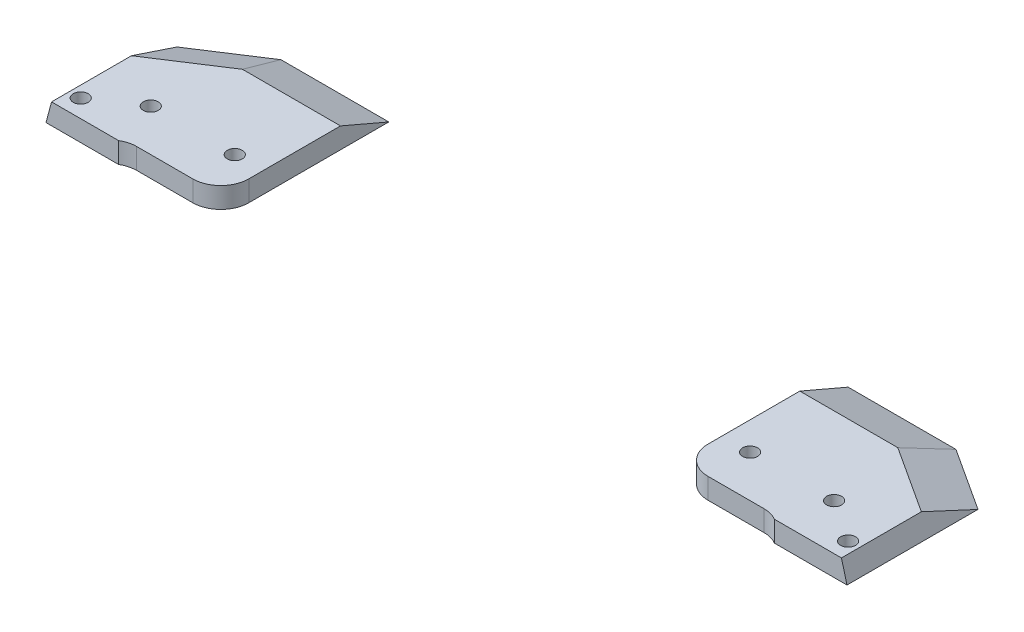
ISO-10303-21;
HEADER;
FILE_DESCRIPTION(('STEP AP214'),'2;1');
FILE_NAME('part.step','',(''),(''),'','','');
FILE_SCHEMA(('AUTOMOTIVE_DESIGN { 1 0 10303 214 1 1 1 1 }'));
ENDSEC;
DATA;
#1=APPLICATION_CONTEXT('core data for automotive mechanical design processes');
#2=APPLICATION_PROTOCOL_DEFINITION('international standard','automotive_design',2000,#1);
#3=PRODUCT_CONTEXT('',#1,'mechanical');
#4=PRODUCT('Part','Part','',(#3));
#5=PRODUCT_RELATED_PRODUCT_CATEGORY('part','',(#4));
#6=PRODUCT_DEFINITION_FORMATION('','',#4);
#7=PRODUCT_DEFINITION_CONTEXT('part definition',#1,'design');
#8=PRODUCT_DEFINITION('design','',#6,#7);
#9=PRODUCT_DEFINITION_SHAPE('','',#8);
#10=(LENGTH_UNIT() NAMED_UNIT(*) SI_UNIT(.MILLI.,.METRE.));
#11=(NAMED_UNIT(*) PLANE_ANGLE_UNIT() SI_UNIT($,.RADIAN.));
#12=(NAMED_UNIT(*) SI_UNIT($,.STERADIAN.) SOLID_ANGLE_UNIT());
#13=UNCERTAINTY_MEASURE_WITH_UNIT(LENGTH_MEASURE(1.E-05),#10,'distance_accuracy_value','');
#14=(GEOMETRIC_REPRESENTATION_CONTEXT(3) GLOBAL_UNCERTAINTY_ASSIGNED_CONTEXT((#13)) GLOBAL_UNIT_ASSIGNED_CONTEXT((#10,
#11,#12)) REPRESENTATION_CONTEXT('',''));
#15=CARTESIAN_POINT('',(0.,0.,0.));
#16=DIRECTION('',(0.,0.,1.));
#17=DIRECTION('',(1.,0.,0.));
#18=AXIS2_PLACEMENT_3D('',#15,#16,#17);
#19=CARTESIAN_POINT('',(-47.683205053471,21.0059940800071,-98.0914798077196));
#20=DIRECTION('',(0.,1.,0.));
#21=DIRECTION('',(0.,0.,1.));
#22=AXIS2_PLACEMENT_3D('',#19,#20,#21);
#23=CYLINDRICAL_SURFACE('',#22,1.7);
#24=CARTESIAN_POINT('',(-47.683205053471,27.3559940800071,-98.0914798077196));
#25=DIRECTION('',(0.,-1.,0.));
#26=DIRECTION('',(0.,0.,1.));
#27=AXIS2_PLACEMENT_3D('',#24,#25,#26);
#28=CIRCLE('',#27,1.7);
#29=CARTESIAN_POINT('',(-47.683205053471,27.3559940800071,-96.3914798077196));
#30=VERTEX_POINT('',#29);
#31=EDGE_CURVE('E294',#30,#30,#28,.T.);
#32=ORIENTED_EDGE('',*,*,#31,.F.);
#33=EDGE_LOOP('',(#32));
#34=FACE_BOUND('',#33,.T.);
#35=CARTESIAN_POINT('',(-47.683205053471,24.6569940800071,-98.0914798077196));
#36=DIRECTION('',(0.,1.,0.));
#37=DIRECTION('',(0.,0.,-1.));
#38=AXIS2_PLACEMENT_3D('',#35,#36,#37);
#39=CIRCLE('',#38,1.7);
#40=CARTESIAN_POINT('',(-47.683205053471,24.6569940800071,-99.7914798077196));
#41=VERTEX_POINT('',#40);
#42=EDGE_CURVE('E336',#41,#41,#39,.F.);
#43=ORIENTED_EDGE('',*,*,#42,.T.);
#44=EDGE_LOOP('',(#43));
#45=FACE_BOUND('',#44,.T.);
#46=ADVANCED_FACE('F65',(#34,#45),#23,.F.);
#47=CARTESIAN_POINT('',(-66.733205053471,21.0059940800071,-98.0914798077196));
#48=DIRECTION('',(0.,1.,0.));
#49=DIRECTION('',(0.,0.,1.));
#50=AXIS2_PLACEMENT_3D('',#47,#48,#49);
#51=CYLINDRICAL_SURFACE('',#50,1.7);
#52=CARTESIAN_POINT('',(-66.733205053471,27.3559940800071,-98.0914798077196));
#53=DIRECTION('',(0.,-1.,0.));
#54=DIRECTION('',(0.,0.,1.));
#55=AXIS2_PLACEMENT_3D('',#52,#53,#54);
#56=CIRCLE('',#55,1.7);
#57=CARTESIAN_POINT('',(-66.733205053471,27.3559940800071,-96.3914798077196));
#58=VERTEX_POINT('',#57);
#59=EDGE_CURVE('E366',#58,#58,#56,.T.);
#60=ORIENTED_EDGE('',*,*,#59,.F.);
#61=EDGE_LOOP('',(#60));
#62=FACE_BOUND('',#61,.T.);
#63=CARTESIAN_POINT('',(-66.733205053471,24.6569940800071,-98.0914798077196));
#64=DIRECTION('',(0.,1.,0.));
#65=DIRECTION('',(0.,0.,-1.));
#66=AXIS2_PLACEMENT_3D('',#63,#64,#65);
#67=CIRCLE('',#66,1.7);
#68=CARTESIAN_POINT('',(-66.733205053471,24.6569940800071,-99.7914798077196));
#69=VERTEX_POINT('',#68);
#70=EDGE_CURVE('E332',#69,#69,#67,.F.);
#71=ORIENTED_EDGE('',*,*,#70,.T.);
#72=EDGE_LOOP('',(#71));
#73=FACE_BOUND('',#72,.T.);
#74=ADVANCED_FACE('F377',(#62,#73),#51,.F.);
#75=CARTESIAN_POINT('',(-76.258205053471,21.0059940800071,-91.7414798077196));
#76=DIRECTION('',(0.,1.,0.));
#77=DIRECTION('',(0.,0.,1.));
#78=AXIS2_PLACEMENT_3D('',#75,#76,#77);
#79=CYLINDRICAL_SURFACE('',#78,1.7);
#80=CARTESIAN_POINT('',(-76.258205053471,27.3559940800071,-91.7414798077196));
#81=DIRECTION('',(0.,-1.,0.));
#82=DIRECTION('',(0.,0.,1.));
#83=AXIS2_PLACEMENT_3D('',#80,#81,#82);
#84=CIRCLE('',#83,1.7);
#85=CARTESIAN_POINT('',(-76.258205053471,27.3559940800071,-90.0414798077196));
#86=VERTEX_POINT('',#85);
#87=EDGE_CURVE('E306',#86,#86,#84,.T.);
#88=ORIENTED_EDGE('',*,*,#87,.F.);
#89=EDGE_LOOP('',(#88));
#90=FACE_BOUND('',#89,.T.);
#91=CARTESIAN_POINT('',(-76.258205053471,24.6569940800071,-91.7414798077196));
#92=DIRECTION('',(0.,1.,0.));
#93=DIRECTION('',(0.,0.,-1.));
#94=AXIS2_PLACEMENT_3D('',#91,#92,#93);
#95=CIRCLE('',#94,1.7);
#96=CARTESIAN_POINT('',(-76.258205053471,24.6569940800071,-93.4414798077196));
#97=VERTEX_POINT('',#96);
#98=EDGE_CURVE('E329',#97,#97,#95,.F.);
#99=ORIENTED_EDGE('',*,*,#98,.T.);
#100=EDGE_LOOP('',(#99));
#101=FACE_BOUND('',#100,.T.);
#102=ADVANCED_FACE('F374',(#90,#101),#79,.F.);
#103=CARTESIAN_POINT('',(-41.333205053471,22.6569940800071,-37.7664798077196));
#104=DIRECTION('',(0.,1.,0.));
#105=DIRECTION('',(0.,0.,1.));
#106=AXIS2_PLACEMENT_3D('',#103,#104,#105);
#107=PLANE('',#106);
#108=CARTESIAN_POINT('',(-76.258205053471,22.6569940800071,-91.7414798077196));
#109=DIRECTION('',(0.,1.,0.));
#110=DIRECTION('',(0.,0.,-1.));
#111=AXIS2_PLACEMENT_3D('',#108,#109,#110);
#112=CIRCLE('',#111,3.);
#113=CARTESIAN_POINT('',(-76.258205053471,22.6569940800071,-94.7414798077196));
#114=VERTEX_POINT('',#113);
#115=EDGE_CURVE('E351',#114,#114,#112,.T.);
#116=ORIENTED_EDGE('',*,*,#115,.T.);
#117=EDGE_LOOP('',(#116));
#118=FACE_BOUND('',#117,.T.);
#119=CARTESIAN_POINT('',(-66.733205053471,22.6569940800071,-98.0914798077196));
#120=DIRECTION('',(0.,1.,0.));
#121=DIRECTION('',(0.,0.,-1.));
#122=AXIS2_PLACEMENT_3D('',#119,#120,#121);
#123=CIRCLE('',#122,3.);
#124=CARTESIAN_POINT('',(-66.733205053471,22.6569940800071,-101.09147980772));
#125=VERTEX_POINT('',#124);
#126=EDGE_CURVE('E357',#125,#125,#123,.T.);
#127=ORIENTED_EDGE('',*,*,#126,.T.);
#128=EDGE_LOOP('',(#127));
#129=FACE_BOUND('',#128,.T.);
#130=CARTESIAN_POINT('',(-47.683205053471,22.6569940800071,-98.0914798077196));
#131=DIRECTION('',(0.,1.,0.));
#132=DIRECTION('',(0.,0.,-1.));
#133=AXIS2_PLACEMENT_3D('',#130,#131,#132);
#134=CIRCLE('',#133,3.);
#135=CARTESIAN_POINT('',(-47.683205053471,22.6569940800071,-101.09147980772));
#136=VERTEX_POINT('',#135);
#137=EDGE_CURVE('E344',#136,#136,#134,.T.);
#138=ORIENTED_EDGE('',*,*,#137,.T.);
#139=EDGE_LOOP('',(#138));
#140=FACE_BOUND('',#139,.T.);
#141=DIRECTION('',(1.,0.,0.));
#142=VECTOR('',#141,1.);
#143=CARTESIAN_POINT('',(-90.228205053471,22.6569940800071,-87.6774798077196));
#144=LINE('',#143,#142);
#145=CARTESIAN_POINT('',(-80.068205053471,22.6569940800071,-87.6774798077196));
#146=VERTEX_POINT('',#145);
#147=CARTESIAN_POINT('',(-63.623572162303,22.6569940800071,-87.6774798077196));
#148=VERTEX_POINT('',#147);
#149=EDGE_CURVE('E89',#146,#148,#144,.T.);
#150=ORIENTED_EDGE('',*,*,#149,.F.);
#151=DIRECTION('',(0.,0.,1.));
#152=VECTOR('',#151,1.);
#153=CARTESIAN_POINT('',(-80.068205053471,22.6569940800071,-126.66657980772));
#154=LINE('',#153,#152);
#155=CARTESIAN_POINT('',(-80.068205053471,22.6569940800071,-117.37960480772));
#156=VERTEX_POINT('',#155);
#157=EDGE_CURVE('E83',#156,#146,#154,.T.);
#158=ORIENTED_EDGE('',*,*,#157,.F.);
#159=CARTESIAN_POINT('',(-80.068205053471,22.6569940800071,-117.37960480772));
#160=DIRECTION('',(0.838443616300637,0.,-0.544988350595414));
#161=VECTOR('',#160,1.);
#162=LINE('',#159,#161);
#163=CARTESIAN_POINT('',(-65.780705053471,22.6569940800071,-126.66647980772));
#164=VERTEX_POINT('',#163);
#165=EDGE_CURVE('E141',#156,#164,#162,.T.);
#166=ORIENTED_EDGE('',*,*,#165,.T.);
#167=CARTESIAN_POINT('',(-65.780705053471,22.6569940800071,-126.66647980772));
#168=DIRECTION('',(1.,0.,0.));
#169=VECTOR('',#168,1.);
#170=LINE('',#167,#169);
#171=CARTESIAN_POINT('',(-41.333205053471,22.6569940800071,-126.66647980772));
#172=VERTEX_POINT('',#171);
#173=EDGE_CURVE('E149',#164,#172,#170,.T.);
#174=ORIENTED_EDGE('',*,*,#173,.T.);
#175=CARTESIAN_POINT('',(-41.333205053471,22.6569940800071,-126.66647980772));
#176=DIRECTION('',(0.,0.,1.));
#177=VECTOR('',#176,1.);
#178=LINE('',#175,#177);
#179=CARTESIAN_POINT('',(-41.333205053471,22.6569940800071,-94.9164798077196));
#180=VERTEX_POINT('',#179);
#181=EDGE_CURVE('E150',#172,#180,#178,.T.);
#182=ORIENTED_EDGE('',*,*,#181,.T.);
#183=CARTESIAN_POINT('',(-47.683205053471,22.6569940800071,-94.9164798077196));
#184=DIRECTION('',(0.,-1.,0.));
#185=DIRECTION('',(0.,0.,1.));
#186=AXIS2_PLACEMENT_3D('',#183,#184,#185);
#187=CIRCLE('',#186,6.35);
#188=CARTESIAN_POINT('',(-47.683205053471,22.6569940800071,-88.5664798077196));
#189=VERTEX_POINT('',#188);
#190=EDGE_CURVE('E297',#189,#180,#187,.F.);
#191=ORIENTED_EDGE('',*,*,#190,.F.);
#192=DIRECTION('',(1.,0.,0.));
#193=VECTOR('',#192,1.);
#194=CARTESIAN_POINT('',(-41.333205053471,22.6569940800071,-88.5664798077196));
#195=LINE('',#194,#193);
#196=CARTESIAN_POINT('',(-60.383205053471,22.6569940800071,-88.5664798077196));
#197=VERTEX_POINT('',#196);
#198=EDGE_CURVE('E293',#197,#189,#195,.T.);
#199=ORIENTED_EDGE('',*,*,#198,.F.);
#200=CARTESIAN_POINT('',(-60.383205053471,22.6569940800071,-82.2164798077196));
#201=DIRECTION('',(0.,-1.,0.));
#202=DIRECTION('',(0.,0.,1.));
#203=AXIS2_PLACEMENT_3D('',#200,#201,#202);
#204=CIRCLE('',#203,6.35);
#205=EDGE_CURVE('E327',#148,#197,#204,.T.);
#206=ORIENTED_EDGE('',*,*,#205,.F.);
#207=EDGE_LOOP('',(#150,#158,#166,#174,#182,#191,#199,#206));
#208=FACE_BOUND('',#207,.T.);
#209=ADVANCED_FACE('F139',(#118,#129,#140,#208),#107,.F.);
#210=CARTESIAN_POINT('',(-41.333205053471,27.3559940800071,-37.7664798077196));
#211=DIRECTION('',(0.,-1.,0.));
#212=DIRECTION('',(0.,0.,-1.));
#213=AXIS2_PLACEMENT_3D('',#210,#211,#212);
#214=PLANE('',#213);
#215=ORIENTED_EDGE('',*,*,#87,.T.);
#216=EDGE_LOOP('',(#215));
#217=FACE_BOUND('',#216,.T.);
#218=ORIENTED_EDGE('',*,*,#59,.T.);
#219=EDGE_LOOP('',(#218));
#220=FACE_BOUND('',#219,.T.);
#221=ORIENTED_EDGE('',*,*,#31,.T.);
#222=EDGE_LOOP('',(#221));
#223=FACE_BOUND('',#222,.T.);
#224=CARTESIAN_POINT('',(-78.8091117982372,27.3559940800071,-105.799640423622));
#225=DIRECTION('',(0.838443616300637,0.,-0.544988350595414));
#226=VECTOR('',#225,1.);
#227=LINE('',#224,#226);
#228=CARTESIAN_POINT('',(-78.8091117982372,27.3559940800071,-105.799640423622));
#229=VERTEX_POINT('',#228);
#230=CARTESIAN_POINT('',(-63.558205053471,27.3559940800071,-115.71272980772));
#231=VERTEX_POINT('',#230);
#232=EDGE_CURVE('E160',#229,#231,#227,.T.);
#233=ORIENTED_EDGE('',*,*,#232,.F.);
#234=DIRECTION('',(0.,0.,1.));
#235=VECTOR('',#234,1.);
#236=CARTESIAN_POINT('',(-78.8091117982372,27.3559940800071,-37.7664798077196));
#237=LINE('',#236,#235);
#238=CARTESIAN_POINT('',(-78.8091117982372,27.3559940800071,-87.6774798077196));
#239=VERTEX_POINT('',#238);
#240=EDGE_CURVE('E134',#229,#239,#237,.T.);
#241=ORIENTED_EDGE('',*,*,#240,.T.);
#242=DIRECTION('',(1.,0.,0.));
#243=VECTOR('',#242,1.);
#244=CARTESIAN_POINT('',(-41.333205053471,27.3559940800071,-87.6774798077196));
#245=LINE('',#244,#243);
#246=CARTESIAN_POINT('',(-63.623572162303,27.3559940800071,-87.6774798077196));
#247=VERTEX_POINT('',#246);
#248=EDGE_CURVE('E342',#239,#247,#245,.T.);
#249=ORIENTED_EDGE('',*,*,#248,.T.);
#250=CARTESIAN_POINT('',(-60.383205053471,27.3559940800071,-82.2164798077196));
#251=DIRECTION('',(0.,1.,0.));
#252=DIRECTION('',(0.,0.,-1.));
#253=AXIS2_PLACEMENT_3D('',#250,#251,#252);
#254=CIRCLE('',#253,6.35);
#255=CARTESIAN_POINT('',(-60.383205053471,27.3559940800071,-88.5664798077196));
#256=VERTEX_POINT('',#255);
#257=EDGE_CURVE('E324',#256,#247,#254,.T.);
#258=ORIENTED_EDGE('',*,*,#257,.F.);
#259=DIRECTION('',(1.,0.,0.));
#260=VECTOR('',#259,1.);
#261=CARTESIAN_POINT('',(-41.333205053471,27.3559940800071,-88.5664798077196));
#262=LINE('',#261,#260);
#263=CARTESIAN_POINT('',(-47.683205053471,27.3559940800071,-88.5664798077196));
#264=VERTEX_POINT('',#263);
#265=EDGE_CURVE('E290',#256,#264,#262,.T.);
#266=ORIENTED_EDGE('',*,*,#265,.T.);
#267=CARTESIAN_POINT('',(-47.683205053471,27.3559940800071,-94.9164798077196));
#268=DIRECTION('',(0.,1.,0.));
#269=DIRECTION('',(0.,0.,-1.));
#270=AXIS2_PLACEMENT_3D('',#267,#268,#269);
#271=CIRCLE('',#270,6.35);
#272=CARTESIAN_POINT('',(-41.333205053471,27.3559940800071,-94.9164798077196));
#273=VERTEX_POINT('',#272);
#274=EDGE_CURVE('E151',#273,#264,#271,.F.);
#275=ORIENTED_EDGE('',*,*,#274,.F.);
#276=CARTESIAN_POINT('',(-41.333205053471,27.3559940800071,-115.71272980772));
#277=DIRECTION('',(0.,0.,1.));
#278=VECTOR('',#277,1.);
#279=LINE('',#276,#278);
#280=CARTESIAN_POINT('',(-41.333205053471,27.3559940800071,-115.71272980772));
#281=VERTEX_POINT('',#280);
#282=EDGE_CURVE('E255',#281,#273,#279,.T.);
#283=ORIENTED_EDGE('',*,*,#282,.F.);
#284=CARTESIAN_POINT('',(-63.558205053471,27.3559940800071,-115.71272980772));
#285=DIRECTION('',(1.,0.,0.));
#286=VECTOR('',#285,1.);
#287=LINE('',#284,#286);
#288=EDGE_CURVE('E172',#231,#281,#287,.T.);
#289=ORIENTED_EDGE('',*,*,#288,.F.);
#290=EDGE_LOOP('',(#233,#241,#249,#258,#266,#275,#283,#289));
#291=FACE_BOUND('',#290,.T.);
#292=ADVANCED_FACE('F188',(#217,#220,#223,#291),#214,.F.);
#293=CARTESIAN_POINT('',(-41.333205053471,55.596707666281,-49.881336650527));
#294=DIRECTION('',(0.,0.919007191605898,-0.394240766254125));
#295=DIRECTION('',(0.,0.394240766254125,0.919007191605898));
#296=AXIS2_PLACEMENT_3D('',#293,#294,#295);
#297=PLANE('',#296);
#298=DIRECTION('',(-0.183305751218197,-0.387560731147046,-0.903435488146829));
#299=VECTOR('',#298,1.);
#300=CARTESIAN_POINT('',(-63.558205053471,27.3559940800071,-115.71272980772));
#301=LINE('',#300,#299);
#302=EDGE_CURVE('E147',#231,#164,#301,.T.);
#303=ORIENTED_EDGE('',*,*,#302,.F.);
#304=ORIENTED_EDGE('',*,*,#288,.T.);
#305=DIRECTION('',(0.,-0.394240766254125,-0.919007191605898));
#306=VECTOR('',#305,1.);
#307=CARTESIAN_POINT('',(-41.333205053471,27.3559940800071,-115.71272980772));
#308=LINE('',#307,#306);
#309=EDGE_CURVE('E153',#281,#172,#308,.T.);
#310=ORIENTED_EDGE('',*,*,#309,.T.);
#311=ORIENTED_EDGE('',*,*,#173,.F.);
#312=EDGE_LOOP('',(#303,#304,#310,#311));
#313=FACE_BOUND('',#312,.T.);
#314=ADVANCED_FACE('F178',(#313),#297,.T.);
#315=CARTESIAN_POINT('',(-41.333205053471,27.3559940800071,-37.7664798077196));
#316=DIRECTION('',(1.,0.,0.));
#317=DIRECTION('',(0.,0.,1.));
#318=AXIS2_PLACEMENT_3D('',#315,#316,#317);
#319=PLANE('',#318);
#320=ORIENTED_EDGE('',*,*,#181,.F.);
#321=ORIENTED_EDGE('',*,*,#309,.F.);
#322=ORIENTED_EDGE('',*,*,#282,.T.);
#323=DIRECTION('',(0.,1.,0.));
#324=VECTOR('',#323,1.);
#325=CARTESIAN_POINT('',(-41.333205053471,27.3559940800071,-94.9164798077196));
#326=LINE('',#325,#324);
#327=EDGE_CURVE('E309',#180,#273,#326,.T.);
#328=ORIENTED_EDGE('',*,*,#327,.F.);
#329=EDGE_LOOP('',(#320,#321,#322,#328));
#330=FACE_BOUND('',#329,.T.);
#331=ADVANCED_FACE('F187',(#330),#319,.T.);
#332=CARTESIAN_POINT('',(-48.4960519978189,56.4317917075317,-48.7862443374856));
#333=DIRECTION('',(-0.224481809597883,0.91122813563382,-0.34535663015059));
#334=DIRECTION('',(0.,0.354401567922344,0.935093326173481));
#335=AXIS2_PLACEMENT_3D('',#332,#333,#334);
#336=PLANE('',#335);
#337=DIRECTION('',(-0.100243770859435,-0.374114845989711,-0.921948625691245));
#338=VECTOR('',#337,1.);
#339=CARTESIAN_POINT('',(-72.1449254450297,52.2270761412848,-44.5086754388216));
#340=LINE('',#339,#338);
#341=EDGE_CURVE('E131',#229,#156,#340,.T.);
#342=ORIENTED_EDGE('',*,*,#341,.F.);
#343=ORIENTED_EDGE('',*,*,#232,.T.);
#344=ORIENTED_EDGE('',*,*,#302,.T.);
#345=ORIENTED_EDGE('',*,*,#165,.F.);
#346=EDGE_LOOP('',(#342,#343,#344,#345));
#347=FACE_BOUND('',#346,.T.);
#348=ADVANCED_FACE('F145',(#347),#336,.T.);
#349=CARTESIAN_POINT('',(-41.333205053471,21.0059940800071,-88.5664798077196));
#350=DIRECTION('',(0.,0.,-1.));
#351=DIRECTION('',(1.,0.,0.));
#352=AXIS2_PLACEMENT_3D('',#349,#350,#351);
#353=PLANE('',#352);
#354=ORIENTED_EDGE('',*,*,#265,.F.);
#355=DIRECTION('',(0.,1.,0.));
#356=VECTOR('',#355,1.);
#357=CARTESIAN_POINT('',(-60.383205053471,27.3559940800071,-88.5664798077196));
#358=LINE('',#357,#356);
#359=EDGE_CURVE('E316',#197,#256,#358,.T.);
#360=ORIENTED_EDGE('',*,*,#359,.F.);
#361=ORIENTED_EDGE('',*,*,#198,.T.);
#362=DIRECTION('',(0.,1.,0.));
#363=VECTOR('',#362,1.);
#364=CARTESIAN_POINT('',(-47.683205053471,22.6569940800071,-88.5664798077196));
#365=LINE('',#364,#363);
#366=EDGE_CURVE('E315',#264,#189,#365,.F.);
#367=ORIENTED_EDGE('',*,*,#366,.F.);
#368=EDGE_LOOP('',(#354,#360,#361,#367));
#369=FACE_BOUND('',#368,.T.);
#370=ADVANCED_FACE('F216',(#369),#353,.F.);
#371=CARTESIAN_POINT('',(-47.683205053471,27.3559940800071,-94.9164798077196));
#372=DIRECTION('',(0.,-1.,0.));
#373=DIRECTION('',(0.,0.,-1.));
#374=AXIS2_PLACEMENT_3D('',#371,#372,#373);
#375=CYLINDRICAL_SURFACE('',#374,6.35);
#376=ORIENTED_EDGE('',*,*,#190,.T.);
#377=ORIENTED_EDGE('',*,*,#327,.T.);
#378=ORIENTED_EDGE('',*,*,#274,.T.);
#379=ORIENTED_EDGE('',*,*,#366,.T.);
#380=EDGE_LOOP('',(#376,#377,#378,#379));
#381=FACE_BOUND('',#380,.T.);
#382=ADVANCED_FACE('F314',(#381),#375,.T.);
#383=CARTESIAN_POINT('',(-60.383205053471,21.0059940800071,-82.2164798077196));
#384=DIRECTION('',(0.,-1.,0.));
#385=DIRECTION('',(0.,0.,-1.));
#386=AXIS2_PLACEMENT_3D('',#383,#384,#385);
#387=CYLINDRICAL_SURFACE('',#386,6.35);
#388=ORIENTED_EDGE('',*,*,#257,.T.);
#389=DIRECTION('',(0.,-1.,0.));
#390=VECTOR('',#389,1.);
#391=CARTESIAN_POINT('',(-63.623572162303,21.0059940800071,-87.6774798077196));
#392=LINE('',#391,#390);
#393=EDGE_CURVE('E75',#247,#148,#392,.T.);
#394=ORIENTED_EDGE('',*,*,#393,.T.);
#395=ORIENTED_EDGE('',*,*,#205,.T.);
#396=ORIENTED_EDGE('',*,*,#359,.T.);
#397=EDGE_LOOP('',(#388,#394,#395,#396));
#398=FACE_BOUND('',#397,.T.);
#399=ADVANCED_FACE('F67',(#398),#387,.F.);
#400=CARTESIAN_POINT('',(-76.258205053471,24.6569940800071,-91.7414798077196));
#401=DIRECTION('',(0.,-1.,0.));
#402=DIRECTION('',(0.,0.,-1.));
#403=AXIS2_PLACEMENT_3D('',#400,#401,#402);
#404=PLANE('',#403);
#405=CARTESIAN_POINT('',(-76.258205053471,24.6569940800071,-91.7414798077196));
#406=DIRECTION('',(0.,1.,0.));
#407=DIRECTION('',(0.,0.,-1.));
#408=AXIS2_PLACEMENT_3D('',#405,#406,#407);
#409=CIRCLE('',#408,3.);
#410=CARTESIAN_POINT('',(-76.258205053471,24.6569940800071,-94.7414798077196));
#411=VERTEX_POINT('',#410);
#412=EDGE_CURVE('E333',#411,#411,#409,.T.);
#413=ORIENTED_EDGE('',*,*,#412,.F.);
#414=EDGE_LOOP('',(#413));
#415=FACE_BOUND('',#414,.T.);
#416=ORIENTED_EDGE('',*,*,#98,.F.);
#417=EDGE_LOOP('',(#416));
#418=FACE_BOUND('',#417,.T.);
#419=ADVANCED_FACE('F381',(#415,#418),#404,.T.);
#420=CARTESIAN_POINT('',(-76.258205053471,24.6569940800071,-91.7414798077196));
#421=DIRECTION('',(0.,-1.,0.));
#422=DIRECTION('',(0.,0.,-1.));
#423=AXIS2_PLACEMENT_3D('',#420,#421,#422);
#424=CYLINDRICAL_SURFACE('',#423,3.);
#425=ORIENTED_EDGE('',*,*,#412,.T.);
#426=EDGE_LOOP('',(#425));
#427=FACE_BOUND('',#426,.T.);
#428=ORIENTED_EDGE('',*,*,#115,.F.);
#429=EDGE_LOOP('',(#428));
#430=FACE_BOUND('',#429,.T.);
#431=ADVANCED_FACE('F383',(#427,#430),#424,.F.);
#432=CARTESIAN_POINT('',(-66.733205053471,24.6569940800071,-98.0914798077196));
#433=DIRECTION('',(0.,-1.,0.));
#434=DIRECTION('',(0.,0.,-1.));
#435=AXIS2_PLACEMENT_3D('',#432,#433,#434);
#436=PLANE('',#435);
#437=CARTESIAN_POINT('',(-66.733205053471,24.6569940800071,-98.0914798077196));
#438=DIRECTION('',(0.,1.,0.));
#439=DIRECTION('',(0.,0.,-1.));
#440=AXIS2_PLACEMENT_3D('',#437,#438,#439);
#441=CIRCLE('',#440,3.);
#442=CARTESIAN_POINT('',(-66.733205053471,24.6569940800071,-101.09147980772));
#443=VERTEX_POINT('',#442);
#444=EDGE_CURVE('E354',#443,#443,#441,.T.);
#445=ORIENTED_EDGE('',*,*,#444,.F.);
#446=EDGE_LOOP('',(#445));
#447=FACE_BOUND('',#446,.T.);
#448=ORIENTED_EDGE('',*,*,#70,.F.);
#449=EDGE_LOOP('',(#448));
#450=FACE_BOUND('',#449,.T.);
#451=ADVANCED_FACE('F391',(#447,#450),#436,.T.);
#452=CARTESIAN_POINT('',(-66.733205053471,24.6569940800071,-98.0914798077196));
#453=DIRECTION('',(0.,-1.,0.));
#454=DIRECTION('',(0.,0.,-1.));
#455=AXIS2_PLACEMENT_3D('',#452,#453,#454);
#456=CYLINDRICAL_SURFACE('',#455,3.);
#457=ORIENTED_EDGE('',*,*,#444,.T.);
#458=EDGE_LOOP('',(#457));
#459=FACE_BOUND('',#458,.T.);
#460=ORIENTED_EDGE('',*,*,#126,.F.);
#461=EDGE_LOOP('',(#460));
#462=FACE_BOUND('',#461,.T.);
#463=ADVANCED_FACE('F439',(#459,#462),#456,.F.);
#464=CARTESIAN_POINT('',(-47.683205053471,24.6569940800071,-98.0914798077196));
#465=DIRECTION('',(0.,-1.,0.));
#466=DIRECTION('',(0.,0.,-1.));
#467=AXIS2_PLACEMENT_3D('',#464,#465,#466);
#468=PLANE('',#467);
#469=CARTESIAN_POINT('',(-47.683205053471,24.6569940800071,-98.0914798077196));
#470=DIRECTION('',(0.,1.,0.));
#471=DIRECTION('',(0.,0.,-1.));
#472=AXIS2_PLACEMENT_3D('',#469,#470,#471);
#473=CIRCLE('',#472,3.);
#474=CARTESIAN_POINT('',(-47.683205053471,24.6569940800071,-101.09147980772));
#475=VERTEX_POINT('',#474);
#476=EDGE_CURVE('E360',#475,#475,#473,.T.);
#477=ORIENTED_EDGE('',*,*,#476,.F.);
#478=EDGE_LOOP('',(#477));
#479=FACE_BOUND('',#478,.T.);
#480=ORIENTED_EDGE('',*,*,#42,.F.);
#481=EDGE_LOOP('',(#480));
#482=FACE_BOUND('',#481,.T.);
#483=ADVANCED_FACE('F433',(#479,#482),#468,.T.);
#484=CARTESIAN_POINT('',(-47.683205053471,24.6569940800071,-98.0914798077196));
#485=DIRECTION('',(0.,-1.,0.));
#486=DIRECTION('',(0.,0.,-1.));
#487=AXIS2_PLACEMENT_3D('',#484,#485,#486);
#488=CYLINDRICAL_SURFACE('',#487,3.);
#489=ORIENTED_EDGE('',*,*,#476,.T.);
#490=EDGE_LOOP('',(#489));
#491=FACE_BOUND('',#490,.T.);
#492=ORIENTED_EDGE('',*,*,#137,.F.);
#493=EDGE_LOOP('',(#492));
#494=FACE_BOUND('',#493,.T.);
#495=ADVANCED_FACE('F409',(#491,#494),#488,.F.);
#496=CARTESIAN_POINT('',(-90.228205053471,75.7639945683738,-87.6774798077196));
#497=DIRECTION('',(0.,0.,-1.));
#498=DIRECTION('',(-1.,0.,0.));
#499=AXIS2_PLACEMENT_3D('',#496,#497,#498);
#500=PLANE('',#499);
#501=ORIENTED_EDGE('',*,*,#248,.F.);
#502=DIRECTION('',(-0.258819045102517,-0.965925826289069,0.));
#503=VECTOR('',#502,1.);
#504=CARTESIAN_POINT('',(-67.4720458801545,69.6665000950497,-87.6774798077196));
#505=LINE('',#504,#503);
#506=EDGE_CURVE('E12',#239,#146,#505,.T.);
#507=ORIENTED_EDGE('',*,*,#506,.T.);
#508=ORIENTED_EDGE('',*,*,#149,.T.);
#509=ORIENTED_EDGE('',*,*,#393,.F.);
#510=EDGE_LOOP('',(#501,#507,#508,#509));
#511=FACE_BOUND('',#510,.T.);
#512=ADVANCED_FACE('F420',(#511),#500,.F.);
#513=CARTESIAN_POINT('',(-75.2968482529229,40.4639400806923,-126.66657980772));
#514=DIRECTION('',(0.965925826289069,-0.258819045102517,0.));
#515=DIRECTION('',(0.258819045102517,0.965925826289069,0.));
#516=AXIS2_PLACEMENT_3D('',#513,#514,#515);
#517=PLANE('',#516);
#518=ORIENTED_EDGE('',*,*,#341,.T.);
#519=ORIENTED_EDGE('',*,*,#157,.T.);
#520=ORIENTED_EDGE('',*,*,#506,.F.);
#521=ORIENTED_EDGE('',*,*,#240,.F.);
#522=EDGE_LOOP('',(#518,#519,#520,#521));
#523=FACE_BOUND('',#522,.T.);
#524=ADVANCED_FACE('F132',(#523),#517,.F.);
#525=CLOSED_SHELL('',(#46,#74,#102,#209,#292,#314,#331,#348,#370,#382,#399,#419,#431,#451,#463,
#483,#495,#512,#524));
#526=MANIFOLD_SOLID_BREP('B2',#525);
#527=CARTESIAN_POINT('',(69.156794946529,21.0059940800071,-98.0914798077196));
#528=DIRECTION('',(0.,1.,0.));
#529=DIRECTION('',(0.,0.,1.));
#530=AXIS2_PLACEMENT_3D('',#527,#528,#529);
#531=CYLINDRICAL_SURFACE('',#530,1.7);
#532=CARTESIAN_POINT('',(69.156794946529,27.3559940800071,-98.0914798077196));
#533=DIRECTION('',(0.,1.,0.));
#534=DIRECTION('',(0.,0.,1.));
#535=AXIS2_PLACEMENT_3D('',#532,#533,#534);
#536=CIRCLE('',#535,1.7);
#537=CARTESIAN_POINT('',(69.156794946529,27.3559940800071,-96.3914798077196));
#538=VERTEX_POINT('',#537);
#539=EDGE_CURVE('E716',#538,#538,#536,.T.);
#540=ORIENTED_EDGE('',*,*,#539,.T.);
#541=EDGE_LOOP('',(#540));
#542=FACE_BOUND('',#541,.T.);
#543=CARTESIAN_POINT('',(69.156794946529,24.6569940800071,-98.0914798077196));
#544=DIRECTION('',(0.,-1.,0.));
#545=DIRECTION('',(0.,0.,-1.));
#546=AXIS2_PLACEMENT_3D('',#543,#544,#545);
#547=CIRCLE('',#546,1.7);
#548=CARTESIAN_POINT('',(69.156794946529,24.6569940800071,-99.7914798077196));
#549=VERTEX_POINT('',#548);
#550=EDGE_CURVE('E857',#549,#549,#547,.F.);
#551=ORIENTED_EDGE('',*,*,#550,.F.);
#552=EDGE_LOOP('',(#551));
#553=FACE_BOUND('',#552,.T.);
#554=ADVANCED_FACE('F584',(#542,#553),#531,.F.);
#555=CARTESIAN_POINT('',(88.206794946529,21.0059940800071,-98.0914798077196));
#556=DIRECTION('',(0.,1.,0.));
#557=DIRECTION('',(0.,0.,1.));
#558=AXIS2_PLACEMENT_3D('',#555,#556,#557);
#559=CYLINDRICAL_SURFACE('',#558,1.7);
#560=CARTESIAN_POINT('',(88.206794946529,27.3559940800071,-98.0914798077196));
#561=DIRECTION('',(0.,1.,0.));
#562=DIRECTION('',(0.,0.,1.));
#563=AXIS2_PLACEMENT_3D('',#560,#561,#562);
#564=CIRCLE('',#563,1.7);
#565=CARTESIAN_POINT('',(88.206794946529,27.3559940800071,-96.3914798077196));
#566=VERTEX_POINT('',#565);
#567=EDGE_CURVE('E887',#566,#566,#564,.T.);
#568=ORIENTED_EDGE('',*,*,#567,.T.);
#569=EDGE_LOOP('',(#568));
#570=FACE_BOUND('',#569,.T.);
#571=CARTESIAN_POINT('',(88.206794946529,24.6569940800071,-98.0914798077196));
#572=DIRECTION('',(0.,-1.,0.));
#573=DIRECTION('',(0.,0.,-1.));
#574=AXIS2_PLACEMENT_3D('',#571,#572,#573);
#575=CIRCLE('',#574,1.7);
#576=CARTESIAN_POINT('',(88.206794946529,24.6569940800071,-99.7914798077196));
#577=VERTEX_POINT('',#576);
#578=EDGE_CURVE('E853',#577,#577,#575,.F.);
#579=ORIENTED_EDGE('',*,*,#578,.F.);
#580=EDGE_LOOP('',(#579));
#581=FACE_BOUND('',#580,.T.);
#582=ADVANCED_FACE('F901',(#570,#581),#559,.F.);
#583=CARTESIAN_POINT('',(97.731794946529,21.0059940800071,-91.7414798077196));
#584=DIRECTION('',(0.,1.,0.));
#585=DIRECTION('',(0.,0.,1.));
#586=AXIS2_PLACEMENT_3D('',#583,#584,#585);
#587=CYLINDRICAL_SURFACE('',#586,1.7);
#588=CARTESIAN_POINT('',(97.731794946529,27.3559940800071,-91.7414798077196));
#589=DIRECTION('',(0.,1.,0.));
#590=DIRECTION('',(0.,0.,1.));
#591=AXIS2_PLACEMENT_3D('',#588,#589,#590);
#592=CIRCLE('',#591,1.7);
#593=CARTESIAN_POINT('',(97.731794946529,27.3559940800071,-90.0414798077196));
#594=VERTEX_POINT('',#593);
#595=EDGE_CURVE('E730',#594,#594,#592,.T.);
#596=ORIENTED_EDGE('',*,*,#595,.T.);
#597=EDGE_LOOP('',(#596));
#598=FACE_BOUND('',#597,.T.);
#599=CARTESIAN_POINT('',(97.731794946529,24.6569940800071,-91.7414798077196));
#600=DIRECTION('',(0.,-1.,0.));
#601=DIRECTION('',(0.,0.,-1.));
#602=AXIS2_PLACEMENT_3D('',#599,#600,#601);
#603=CIRCLE('',#602,1.7);
#604=CARTESIAN_POINT('',(97.731794946529,24.6569940800071,-93.4414798077196));
#605=VERTEX_POINT('',#604);
#606=EDGE_CURVE('E850',#605,#605,#603,.F.);
#607=ORIENTED_EDGE('',*,*,#606,.F.);
#608=EDGE_LOOP('',(#607));
#609=FACE_BOUND('',#608,.T.);
#610=ADVANCED_FACE('F695',(#598,#609),#587,.F.);
#611=CARTESIAN_POINT('',(62.806794946529,22.6569940800071,-37.7664798077196));
#612=DIRECTION('',(0.,1.,0.));
#613=DIRECTION('',(0.,0.,1.));
#614=AXIS2_PLACEMENT_3D('',#611,#612,#613);
#615=PLANE('',#614);
#616=CARTESIAN_POINT('',(97.731794946529,22.6569940800071,-91.7414798077196));
#617=DIRECTION('',(0.,-1.,0.));
#618=DIRECTION('',(0.,0.,-1.));
#619=AXIS2_PLACEMENT_3D('',#616,#617,#618);
#620=CIRCLE('',#619,3.);
#621=CARTESIAN_POINT('',(97.731794946529,22.6569940800071,-94.7414798077196));
#622=VERTEX_POINT('',#621);
#623=EDGE_CURVE('E875',#622,#622,#620,.T.);
#624=ORIENTED_EDGE('',*,*,#623,.F.);
#625=EDGE_LOOP('',(#624));
#626=FACE_BOUND('',#625,.T.);
#627=CARTESIAN_POINT('',(88.206794946529,22.6569940800071,-98.0914798077196));
#628=DIRECTION('',(0.,-1.,0.));
#629=DIRECTION('',(0.,0.,-1.));
#630=AXIS2_PLACEMENT_3D('',#627,#628,#629);
#631=CIRCLE('',#630,3.);
#632=CARTESIAN_POINT('',(88.206794946529,22.6569940800071,-101.09147980772));
#633=VERTEX_POINT('',#632);
#634=EDGE_CURVE('E881',#633,#633,#631,.T.);
#635=ORIENTED_EDGE('',*,*,#634,.F.);
#636=EDGE_LOOP('',(#635));
#637=FACE_BOUND('',#636,.T.);
#638=CARTESIAN_POINT('',(69.156794946529,22.6569940800071,-98.0914798077196));
#639=DIRECTION('',(0.,-1.,0.));
#640=DIRECTION('',(0.,0.,-1.));
#641=AXIS2_PLACEMENT_3D('',#638,#639,#640);
#642=CIRCLE('',#641,3.);
#643=CARTESIAN_POINT('',(69.156794946529,22.6569940800071,-101.09147980772));
#644=VERTEX_POINT('',#643);
#645=EDGE_CURVE('E863',#644,#644,#642,.T.);
#646=ORIENTED_EDGE('',*,*,#645,.F.);
#647=EDGE_LOOP('',(#646));
#648=FACE_BOUND('',#647,.T.);
#649=CARTESIAN_POINT('',(101.541794946529,22.6569940800071,-117.37960480772));
#650=DIRECTION('',(-0.838443616300637,0.,-0.544988350595415));
#651=VECTOR('',#650,1.);
#652=LINE('',#649,#651);
#653=CARTESIAN_POINT('',(101.541794946529,22.6569940800071,-117.37960480772));
#654=VERTEX_POINT('',#653);
#655=CARTESIAN_POINT('',(87.254294946529,22.6569940800071,-126.66647980772));
#656=VERTEX_POINT('',#655);
#657=EDGE_CURVE('E661',#654,#656,#652,.T.);
#658=ORIENTED_EDGE('',*,*,#657,.F.);
#659=DIRECTION('',(0.,0.,1.));
#660=VECTOR('',#659,1.);
#661=CARTESIAN_POINT('',(101.541794946529,22.6569940800071,-126.66657980772));
#662=LINE('',#661,#660);
#663=CARTESIAN_POINT('',(101.541794946529,22.6569940800071,-87.6774798077196));
#664=VERTEX_POINT('',#663);
#665=EDGE_CURVE('E649',#654,#664,#662,.T.);
#666=ORIENTED_EDGE('',*,*,#665,.T.);
#667=DIRECTION('',(1.,0.,0.));
#668=VECTOR('',#667,1.);
#669=CARTESIAN_POINT('',(-90.228205053471,22.6569940800071,-87.6774798077196));
#670=LINE('',#669,#668);
#671=CARTESIAN_POINT('',(85.0971620553609,22.6569940800071,-87.6774798077196));
#672=VERTEX_POINT('',#671);
#673=EDGE_CURVE('E665',#672,#664,#670,.T.);
#674=ORIENTED_EDGE('',*,*,#673,.F.);
#675=CARTESIAN_POINT('',(81.856794946529,22.6569940800071,-82.2164798077196));
#676=DIRECTION('',(0.,1.,0.));
#677=DIRECTION('',(0.,0.,1.));
#678=AXIS2_PLACEMENT_3D('',#675,#676,#677);
#679=CIRCLE('',#678,6.35);
#680=CARTESIAN_POINT('',(81.856794946529,22.6569940800071,-88.5664798077196));
#681=VERTEX_POINT('',#680);
#682=EDGE_CURVE('E848',#672,#681,#679,.T.);
#683=ORIENTED_EDGE('',*,*,#682,.T.);
#684=DIRECTION('',(-1.,0.,0.));
#685=VECTOR('',#684,1.);
#686=CARTESIAN_POINT('',(62.806794946529,22.6569940800071,-88.5664798077196));
#687=LINE('',#686,#685);
#688=CARTESIAN_POINT('',(69.156794946529,22.6569940800071,-88.5664798077196));
#689=VERTEX_POINT('',#688);
#690=EDGE_CURVE('E715',#681,#689,#687,.T.);
#691=ORIENTED_EDGE('',*,*,#690,.T.);
#692=CARTESIAN_POINT('',(69.156794946529,22.6569940800071,-94.9164798077196));
#693=DIRECTION('',(0.,1.,0.));
#694=DIRECTION('',(0.,0.,1.));
#695=AXIS2_PLACEMENT_3D('',#692,#693,#694);
#696=CIRCLE('',#695,6.35);
#697=CARTESIAN_POINT('',(62.806794946529,22.6569940800071,-94.9164798077196));
#698=VERTEX_POINT('',#697);
#699=EDGE_CURVE('E719',#689,#698,#696,.F.);
#700=ORIENTED_EDGE('',*,*,#699,.T.);
#701=CARTESIAN_POINT('',(62.806794946529,22.6569940800071,-126.66647980772));
#702=DIRECTION('',(0.,0.,1.));
#703=VECTOR('',#702,1.);
#704=LINE('',#701,#703);
#705=CARTESIAN_POINT('',(62.806794946529,22.6569940800071,-126.66647980772));
#706=VERTEX_POINT('',#705);
#707=EDGE_CURVE('E674',#706,#698,#704,.T.);
#708=ORIENTED_EDGE('',*,*,#707,.F.);
#709=CARTESIAN_POINT('',(87.254294946529,22.6569940800071,-126.66647980772));
#710=DIRECTION('',(-1.,0.,0.));
#711=VECTOR('',#710,1.);
#712=LINE('',#709,#711);
#713=EDGE_CURVE('E671',#656,#706,#712,.T.);
#714=ORIENTED_EDGE('',*,*,#713,.F.);
#715=EDGE_LOOP('',(#658,#666,#674,#683,#691,#700,#708,#714));
#716=FACE_BOUND('',#715,.T.);
#717=ADVANCED_FACE('F668',(#626,#637,#648,#716),#615,.F.);
#718=CARTESIAN_POINT('',(62.806794946529,27.3559940800071,-37.7664798077196));
#719=DIRECTION('',(0.,-1.,0.));
#720=DIRECTION('',(0.,0.,-1.));
#721=AXIS2_PLACEMENT_3D('',#718,#719,#720);
#722=PLANE('',#721);
#723=ORIENTED_EDGE('',*,*,#595,.F.);
#724=EDGE_LOOP('',(#723));
#725=FACE_BOUND('',#724,.T.);
#726=ORIENTED_EDGE('',*,*,#567,.F.);
#727=EDGE_LOOP('',(#726));
#728=FACE_BOUND('',#727,.T.);
#729=ORIENTED_EDGE('',*,*,#539,.F.);
#730=EDGE_LOOP('',(#729));
#731=FACE_BOUND('',#730,.T.);
#732=DIRECTION('',(1.,0.,0.));
#733=VECTOR('',#732,1.);
#734=CARTESIAN_POINT('',(62.806794946529,27.3559940800071,-87.6774798077196));
#735=LINE('',#734,#733);
#736=CARTESIAN_POINT('',(85.0971620553609,27.3559940800071,-87.6774798077196));
#737=VERTEX_POINT('',#736);
#738=CARTESIAN_POINT('',(100.282701691295,27.3559940800071,-87.6774798077196));
#739=VERTEX_POINT('',#738);
#740=EDGE_CURVE('E608',#737,#739,#735,.T.);
#741=ORIENTED_EDGE('',*,*,#740,.T.);
#742=DIRECTION('',(0.,0.,-1.));
#743=VECTOR('',#742,1.);
#744=CARTESIAN_POINT('',(100.282701691295,27.3559940800071,-37.7664798077196));
#745=LINE('',#744,#743);
#746=CARTESIAN_POINT('',(100.282701691295,27.3559940800071,-105.799640423622));
#747=VERTEX_POINT('',#746);
#748=EDGE_CURVE('E602',#739,#747,#745,.T.);
#749=ORIENTED_EDGE('',*,*,#748,.T.);
#750=CARTESIAN_POINT('',(100.282701691295,27.3559940800071,-105.799640423622));
#751=DIRECTION('',(-0.838443616300637,0.,-0.544988350595414));
#752=VECTOR('',#751,1.);
#753=LINE('',#750,#752);
#754=CARTESIAN_POINT('',(85.031794946529,27.3559940800071,-115.71272980772));
#755=VERTEX_POINT('',#754);
#756=EDGE_CURVE('E664',#747,#755,#753,.T.);
#757=ORIENTED_EDGE('',*,*,#756,.T.);
#758=CARTESIAN_POINT('',(85.031794946529,27.3559940800071,-115.71272980772));
#759=DIRECTION('',(-1.,0.,0.));
#760=VECTOR('',#759,1.);
#761=LINE('',#758,#760);
#762=CARTESIAN_POINT('',(62.806794946529,27.3559940800071,-115.71272980772));
#763=VERTEX_POINT('',#762);
#764=EDGE_CURVE('E797',#755,#763,#761,.T.);
#765=ORIENTED_EDGE('',*,*,#764,.T.);
#766=CARTESIAN_POINT('',(62.806794946529,27.3559940800071,-115.71272980772));
#767=DIRECTION('',(0.,0.,1.));
#768=VECTOR('',#767,1.);
#769=LINE('',#766,#768);
#770=CARTESIAN_POINT('',(62.806794946529,27.3559940800071,-94.9164798077196));
#771=VERTEX_POINT('',#770);
#772=EDGE_CURVE('E725',#763,#771,#769,.T.);
#773=ORIENTED_EDGE('',*,*,#772,.T.);
#774=CARTESIAN_POINT('',(69.156794946529,27.3559940800071,-94.9164798077196));
#775=DIRECTION('',(0.,-1.,0.));
#776=DIRECTION('',(0.,0.,-1.));
#777=AXIS2_PLACEMENT_3D('',#774,#775,#776);
#778=CIRCLE('',#777,6.35);
#779=CARTESIAN_POINT('',(69.156794946529,27.3559940800071,-88.5664798077196));
#780=VERTEX_POINT('',#779);
#781=EDGE_CURVE('E717',#771,#780,#778,.F.);
#782=ORIENTED_EDGE('',*,*,#781,.T.);
#783=DIRECTION('',(-1.,0.,0.));
#784=VECTOR('',#783,1.);
#785=CARTESIAN_POINT('',(62.806794946529,27.3559940800071,-88.5664798077196));
#786=LINE('',#785,#784);
#787=CARTESIAN_POINT('',(81.856794946529,27.3559940800071,-88.5664798077196));
#788=VERTEX_POINT('',#787);
#789=EDGE_CURVE('E712',#788,#780,#786,.T.);
#790=ORIENTED_EDGE('',*,*,#789,.F.);
#791=CARTESIAN_POINT('',(81.856794946529,27.3559940800071,-82.2164798077196));
#792=DIRECTION('',(0.,-1.,0.));
#793=DIRECTION('',(0.,0.,-1.));
#794=AXIS2_PLACEMENT_3D('',#791,#792,#793);
#795=CIRCLE('',#794,6.35);
#796=EDGE_CURVE('E845',#788,#737,#795,.T.);
#797=ORIENTED_EDGE('',*,*,#796,.T.);
#798=EDGE_LOOP('',(#741,#749,#757,#765,#773,#782,#790,#797));
#799=FACE_BOUND('',#798,.T.);
#800=ADVANCED_FACE('F694',(#725,#728,#731,#799),#722,.F.);
#801=CARTESIAN_POINT('',(62.806794946529,55.596707666281,-49.8813366505269));
#802=DIRECTION('',(0.,0.919007191605898,-0.394240766254125));
#803=DIRECTION('',(0.,0.394240766254125,0.919007191605898));
#804=AXIS2_PLACEMENT_3D('',#801,#802,#803);
#805=PLANE('',#804);
#806=DIRECTION('',(0.183305751218197,-0.387560731147046,-0.903435488146829));
#807=VECTOR('',#806,1.);
#808=CARTESIAN_POINT('',(85.031794946529,27.3559940800071,-115.71272980772));
#809=LINE('',#808,#807);
#810=EDGE_CURVE('E798',#755,#656,#809,.T.);
#811=ORIENTED_EDGE('',*,*,#810,.T.);
#812=ORIENTED_EDGE('',*,*,#713,.T.);
#813=DIRECTION('',(0.,-0.394240766254125,-0.919007191605898));
#814=VECTOR('',#813,1.);
#815=CARTESIAN_POINT('',(62.806794946529,27.3559940800071,-115.71272980772));
#816=LINE('',#815,#814);
#817=EDGE_CURVE('E741',#763,#706,#816,.T.);
#818=ORIENTED_EDGE('',*,*,#817,.F.);
#819=ORIENTED_EDGE('',*,*,#764,.F.);
#820=EDGE_LOOP('',(#811,#812,#818,#819));
#821=FACE_BOUND('',#820,.T.);
#822=ADVANCED_FACE('F752',(#821),#805,.T.);
#823=CARTESIAN_POINT('',(62.806794946529,27.3559940800071,-37.7664798077196));
#824=DIRECTION('',(-1.,0.,0.));
#825=DIRECTION('',(0.,0.,1.));
#826=AXIS2_PLACEMENT_3D('',#823,#824,#825);
#827=PLANE('',#826);
#828=ORIENTED_EDGE('',*,*,#707,.T.);
#829=DIRECTION('',(0.,1.,0.));
#830=VECTOR('',#829,1.);
#831=CARTESIAN_POINT('',(62.806794946529,27.3559940800071,-94.9164798077196));
#832=LINE('',#831,#830);
#833=EDGE_CURVE('E832',#698,#771,#832,.T.);
#834=ORIENTED_EDGE('',*,*,#833,.T.);
#835=ORIENTED_EDGE('',*,*,#772,.F.);
#836=ORIENTED_EDGE('',*,*,#817,.T.);
#837=EDGE_LOOP('',(#828,#834,#835,#836));
#838=FACE_BOUND('',#837,.T.);
#839=ADVANCED_FACE('F743',(#838),#827,.T.);
#840=CARTESIAN_POINT('',(69.9696418908769,56.4317917075317,-48.7862443374856));
#841=DIRECTION('',(0.224481809597883,0.91122813563382,-0.34535663015059));
#842=DIRECTION('',(0.,0.354401567922344,0.935093326173481));
#843=AXIS2_PLACEMENT_3D('',#840,#841,#842);
#844=PLANE('',#843);
#845=DIRECTION('',(-0.100243770859436,0.374114845989711,0.921948625691245));
#846=VECTOR('',#845,1.);
#847=CARTESIAN_POINT('',(93.6185153380876,52.2270761412848,-44.5086754388215));
#848=LINE('',#847,#846);
#849=EDGE_CURVE('E652',#654,#747,#848,.T.);
#850=ORIENTED_EDGE('',*,*,#849,.F.);
#851=ORIENTED_EDGE('',*,*,#657,.T.);
#852=ORIENTED_EDGE('',*,*,#810,.F.);
#853=ORIENTED_EDGE('',*,*,#756,.F.);
#854=EDGE_LOOP('',(#850,#851,#852,#853));
#855=FACE_BOUND('',#854,.T.);
#856=ADVANCED_FACE('F659',(#855),#844,.T.);
#857=CARTESIAN_POINT('',(62.806794946529,21.0059940800071,-88.5664798077196));
#858=DIRECTION('',(0.,0.,-1.));
#859=DIRECTION('',(-1.,0.,0.));
#860=AXIS2_PLACEMENT_3D('',#857,#858,#859);
#861=PLANE('',#860);
#862=ORIENTED_EDGE('',*,*,#789,.T.);
#863=DIRECTION('',(0.,1.,0.));
#864=VECTOR('',#863,1.);
#865=CARTESIAN_POINT('',(69.156794946529,22.6569940800071,-88.5664798077196));
#866=LINE('',#865,#864);
#867=EDGE_CURVE('E838',#780,#689,#866,.F.);
#868=ORIENTED_EDGE('',*,*,#867,.T.);
#869=ORIENTED_EDGE('',*,*,#690,.F.);
#870=DIRECTION('',(0.,1.,0.));
#871=VECTOR('',#870,1.);
#872=CARTESIAN_POINT('',(81.856794946529,27.3559940800071,-88.5664798077196));
#873=LINE('',#872,#871);
#874=EDGE_CURVE('E835',#681,#788,#873,.T.);
#875=ORIENTED_EDGE('',*,*,#874,.T.);
#876=EDGE_LOOP('',(#862,#868,#869,#875));
#877=FACE_BOUND('',#876,.T.);
#878=ADVANCED_FACE('F779',(#877),#861,.F.);
#879=CARTESIAN_POINT('',(69.156794946529,27.3559940800071,-94.9164798077196));
#880=DIRECTION('',(0.,-1.,0.));
#881=DIRECTION('',(0.,0.,-1.));
#882=AXIS2_PLACEMENT_3D('',#879,#880,#881);
#883=CYLINDRICAL_SURFACE('',#882,6.35);
#884=ORIENTED_EDGE('',*,*,#699,.F.);
#885=ORIENTED_EDGE('',*,*,#867,.F.);
#886=ORIENTED_EDGE('',*,*,#781,.F.);
#887=ORIENTED_EDGE('',*,*,#833,.F.);
#888=EDGE_LOOP('',(#884,#885,#886,#887));
#889=FACE_BOUND('',#888,.T.);
#890=ADVANCED_FACE('F699',(#889),#883,.T.);
#891=CARTESIAN_POINT('',(81.856794946529,21.0059940800071,-82.2164798077196));
#892=DIRECTION('',(0.,-1.,0.));
#893=DIRECTION('',(0.,0.,-1.));
#894=AXIS2_PLACEMENT_3D('',#891,#892,#893);
#895=CYLINDRICAL_SURFACE('',#894,6.35);
#896=ORIENTED_EDGE('',*,*,#682,.F.);
#897=DIRECTION('',(0.,-1.,0.));
#898=VECTOR('',#897,1.);
#899=CARTESIAN_POINT('',(85.0971620553609,21.0059940800071,-87.6774798077196));
#900=LINE('',#899,#898);
#901=EDGE_CURVE('E594',#672,#737,#900,.F.);
#902=ORIENTED_EDGE('',*,*,#901,.T.);
#903=ORIENTED_EDGE('',*,*,#796,.F.);
#904=ORIENTED_EDGE('',*,*,#874,.F.);
#905=EDGE_LOOP('',(#896,#902,#903,#904));
#906=FACE_BOUND('',#905,.T.);
#907=ADVANCED_FACE('F586',(#906),#895,.F.);
#908=CARTESIAN_POINT('',(97.731794946529,24.6569940800071,-91.7414798077196));
#909=DIRECTION('',(0.,-1.,0.));
#910=DIRECTION('',(0.,0.,-1.));
#911=AXIS2_PLACEMENT_3D('',#908,#909,#910);
#912=PLANE('',#911);
#913=CARTESIAN_POINT('',(97.731794946529,24.6569940800071,-91.7414798077196));
#914=DIRECTION('',(0.,-1.,0.));
#915=DIRECTION('',(0.,0.,-1.));
#916=AXIS2_PLACEMENT_3D('',#913,#914,#915);
#917=CIRCLE('',#916,3.);
#918=CARTESIAN_POINT('',(97.731794946529,24.6569940800071,-94.7414798077196));
#919=VERTEX_POINT('',#918);
#920=EDGE_CURVE('E854',#919,#919,#917,.T.);
#921=ORIENTED_EDGE('',*,*,#920,.T.);
#922=EDGE_LOOP('',(#921));
#923=FACE_BOUND('',#922,.T.);
#924=ORIENTED_EDGE('',*,*,#606,.T.);
#925=EDGE_LOOP('',(#924));
#926=FACE_BOUND('',#925,.T.);
#927=ADVANCED_FACE('F979',(#923,#926),#912,.T.);
#928=CARTESIAN_POINT('',(97.731794946529,24.6569940800071,-91.7414798077196));
#929=DIRECTION('',(0.,-1.,0.));
#930=DIRECTION('',(0.,0.,-1.));
#931=AXIS2_PLACEMENT_3D('',#928,#929,#930);
#932=CYLINDRICAL_SURFACE('',#931,3.);
#933=ORIENTED_EDGE('',*,*,#920,.F.);
#934=EDGE_LOOP('',(#933));
#935=FACE_BOUND('',#934,.T.);
#936=ORIENTED_EDGE('',*,*,#623,.T.);
#937=EDGE_LOOP('',(#936));
#938=FACE_BOUND('',#937,.T.);
#939=ADVANCED_FACE('F987',(#935,#938),#932,.F.);
#940=CARTESIAN_POINT('',(88.206794946529,24.6569940800071,-98.0914798077196));
#941=DIRECTION('',(0.,-1.,0.));
#942=DIRECTION('',(0.,0.,-1.));
#943=AXIS2_PLACEMENT_3D('',#940,#941,#942);
#944=PLANE('',#943);
#945=CARTESIAN_POINT('',(88.206794946529,24.6569940800071,-98.0914798077196));
#946=DIRECTION('',(0.,-1.,0.));
#947=DIRECTION('',(0.,0.,-1.));
#948=AXIS2_PLACEMENT_3D('',#945,#946,#947);
#949=CIRCLE('',#948,3.);
#950=CARTESIAN_POINT('',(88.206794946529,24.6569940800071,-101.09147980772));
#951=VERTEX_POINT('',#950);
#952=EDGE_CURVE('E878',#951,#951,#949,.T.);
#953=ORIENTED_EDGE('',*,*,#952,.T.);
#954=EDGE_LOOP('',(#953));
#955=FACE_BOUND('',#954,.T.);
#956=ORIENTED_EDGE('',*,*,#578,.T.);
#957=EDGE_LOOP('',(#956));
#958=FACE_BOUND('',#957,.T.);
#959=ADVANCED_FACE('F919',(#955,#958),#944,.T.);
#960=CARTESIAN_POINT('',(88.206794946529,24.6569940800071,-98.0914798077196));
#961=DIRECTION('',(0.,-1.,0.));
#962=DIRECTION('',(0.,0.,-1.));
#963=AXIS2_PLACEMENT_3D('',#960,#961,#962);
#964=CYLINDRICAL_SURFACE('',#963,3.);
#965=ORIENTED_EDGE('',*,*,#952,.F.);
#966=EDGE_LOOP('',(#965));
#967=FACE_BOUND('',#966,.T.);
#968=ORIENTED_EDGE('',*,*,#634,.T.);
#969=EDGE_LOOP('',(#968));
#970=FACE_BOUND('',#969,.T.);
#971=ADVANCED_FACE('F908',(#967,#970),#964,.F.);
#972=CARTESIAN_POINT('',(69.156794946529,24.6569940800071,-98.0914798077196));
#973=DIRECTION('',(0.,-1.,0.));
#974=DIRECTION('',(0.,0.,-1.));
#975=AXIS2_PLACEMENT_3D('',#972,#973,#974);
#976=PLANE('',#975);
#977=CARTESIAN_POINT('',(69.156794946529,24.6569940800071,-98.0914798077196));
#978=DIRECTION('',(0.,-1.,0.));
#979=DIRECTION('',(0.,0.,-1.));
#980=AXIS2_PLACEMENT_3D('',#977,#978,#979);
#981=CIRCLE('',#980,3.);
#982=CARTESIAN_POINT('',(69.156794946529,24.6569940800071,-101.09147980772));
#983=VERTEX_POINT('',#982);
#984=EDGE_CURVE('E866',#983,#983,#981,.T.);
#985=ORIENTED_EDGE('',*,*,#984,.T.);
#986=EDGE_LOOP('',(#985));
#987=FACE_BOUND('',#986,.T.);
#988=ORIENTED_EDGE('',*,*,#550,.T.);
#989=EDGE_LOOP('',(#988));
#990=FACE_BOUND('',#989,.T.);
#991=ADVANCED_FACE('F905',(#987,#990),#976,.T.);
#992=CARTESIAN_POINT('',(69.156794946529,24.6569940800071,-98.0914798077196));
#993=DIRECTION('',(0.,-1.,0.));
#994=DIRECTION('',(0.,0.,-1.));
#995=AXIS2_PLACEMENT_3D('',#992,#993,#994);
#996=CYLINDRICAL_SURFACE('',#995,3.);
#997=ORIENTED_EDGE('',*,*,#984,.F.);
#998=EDGE_LOOP('',(#997));
#999=FACE_BOUND('',#998,.T.);
#1000=ORIENTED_EDGE('',*,*,#645,.T.);
#1001=EDGE_LOOP('',(#1000));
#1002=FACE_BOUND('',#1001,.T.);
#1003=ADVANCED_FACE('F907',(#999,#1002),#996,.F.);
#1004=CARTESIAN_POINT('',(-90.228205053471,75.7639945683738,-87.6774798077196));
#1005=DIRECTION('',(0.,0.,-1.));
#1006=DIRECTION('',(-1.,0.,0.));
#1007=AXIS2_PLACEMENT_3D('',#1004,#1005,#1006);
#1008=PLANE('',#1007);
#1009=ORIENTED_EDGE('',*,*,#673,.T.);
#1010=DIRECTION('',(-0.258819045102518,0.965925826289069,0.));
#1011=VECTOR('',#1010,1.);
#1012=CARTESIAN_POINT('',(75.4188906663086,120.149000095049,-87.6774798077196));
#1013=LINE('',#1012,#1011);
#1014=EDGE_CURVE('E63',#664,#739,#1013,.T.);
#1015=ORIENTED_EDGE('',*,*,#1014,.T.);
#1016=ORIENTED_EDGE('',*,*,#740,.F.);
#1017=ORIENTED_EDGE('',*,*,#901,.F.);
#1018=EDGE_LOOP('',(#1009,#1015,#1016,#1017));
#1019=FACE_BOUND('',#1018,.T.);
#1020=ADVANCED_FACE('F916',(#1019),#1008,.F.);
#1021=CARTESIAN_POINT('',(96.7704381459808,40.4639400806923,-126.66657980772));
#1022=DIRECTION('',(-0.965925826289069,-0.258819045102518,0.));
#1023=DIRECTION('',(0.258819045102518,-0.965925826289069,0.));
#1024=AXIS2_PLACEMENT_3D('',#1021,#1022,#1023);
#1025=PLANE('',#1024);
#1026=ORIENTED_EDGE('',*,*,#849,.T.);
#1027=ORIENTED_EDGE('',*,*,#748,.F.);
#1028=ORIENTED_EDGE('',*,*,#1014,.F.);
#1029=ORIENTED_EDGE('',*,*,#665,.F.);
#1030=EDGE_LOOP('',(#1026,#1027,#1028,#1029));
#1031=FACE_BOUND('',#1030,.T.);
#1032=ADVANCED_FACE('F651',(#1031),#1025,.F.);
#1033=CLOSED_SHELL('',(#554,#582,#610,#717,#800,#822,#839,#856,#878,#890,#907,#927,#939,#959,
#971,#991,#1003,#1020,#1032));
#1034=MANIFOLD_SOLID_BREP('B6',#1033);
#1035=ADVANCED_BREP_SHAPE_REPRESENTATION('',(#18,#526,#1034),#14);
#1036=SHAPE_DEFINITION_REPRESENTATION(#9,#1035);
ENDSEC;
END-ISO-10303-21;
